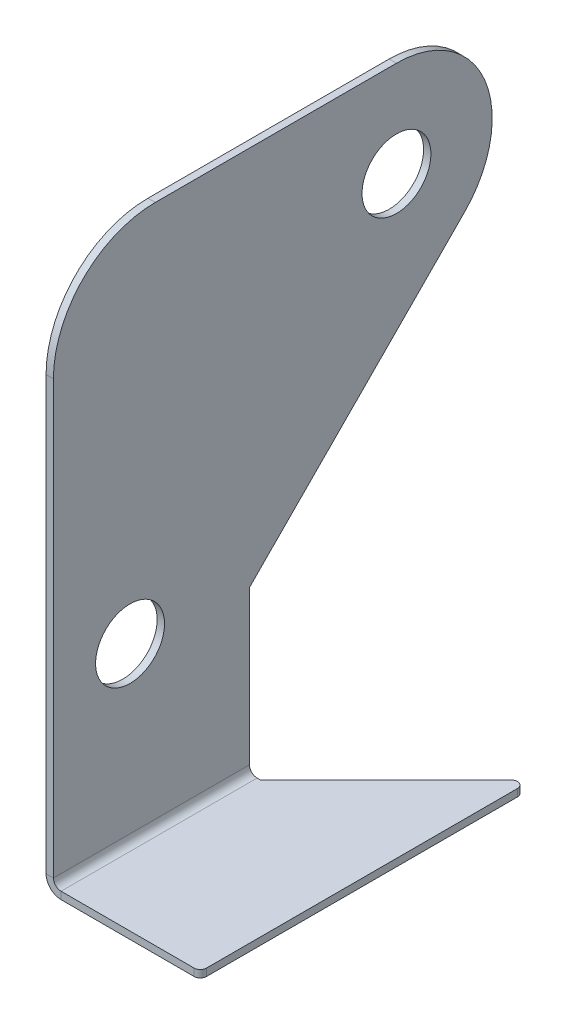
ISO-10303-21;
HEADER;
FILE_DESCRIPTION(('STEP AP214'),'2;1');
FILE_NAME('part.step','',(''),(''),'','','');
FILE_SCHEMA(('AUTOMOTIVE_DESIGN { 1 0 10303 214 1 1 1 1 }'));
ENDSEC;
DATA;
#1=APPLICATION_CONTEXT('core data for automotive mechanical design processes');
#2=APPLICATION_PROTOCOL_DEFINITION('international standard','automotive_design',2000,#1);
#3=PRODUCT_CONTEXT('',#1,'mechanical');
#4=PRODUCT('Part','Part','',(#3));
#5=PRODUCT_RELATED_PRODUCT_CATEGORY('part','',(#4));
#6=PRODUCT_DEFINITION_FORMATION('','',#4);
#7=PRODUCT_DEFINITION_CONTEXT('part definition',#1,'design');
#8=PRODUCT_DEFINITION('design','',#6,#7);
#9=PRODUCT_DEFINITION_SHAPE('','',#8);
#10=(LENGTH_UNIT() NAMED_UNIT(*) SI_UNIT(.MILLI.,.METRE.));
#11=(NAMED_UNIT(*) PLANE_ANGLE_UNIT() SI_UNIT($,.RADIAN.));
#12=(NAMED_UNIT(*) SI_UNIT($,.STERADIAN.) SOLID_ANGLE_UNIT());
#13=UNCERTAINTY_MEASURE_WITH_UNIT(LENGTH_MEASURE(1.E-05),#10,'distance_accuracy_value','');
#14=(GEOMETRIC_REPRESENTATION_CONTEXT(3) GLOBAL_UNCERTAINTY_ASSIGNED_CONTEXT((#13)) GLOBAL_UNIT_ASSIGNED_CONTEXT((#10,
#11,#12)) REPRESENTATION_CONTEXT('',''));
#15=CARTESIAN_POINT('',(0.,0.,0.));
#16=DIRECTION('',(0.,0.,1.));
#17=DIRECTION('',(1.,0.,0.));
#18=AXIS2_PLACEMENT_3D('',#15,#16,#17);
#19=CARTESIAN_POINT('',(0.,0.,81.28));
#20=DIRECTION('',(0.,0.,-1.));
#21=DIRECTION('',(0.,1.,0.));
#22=AXIS2_PLACEMENT_3D('',#19,#20,#21);
#23=PLANE('',#22);
#24=DIRECTION('',(-1.,0.,0.));
#25=VECTOR('',#24,1.);
#26=CARTESIAN_POINT('',(0.,6.21283999999999,81.28));
#27=LINE('',#26,#25);
#28=CARTESIAN_POINT('',(3.03784,6.21283999999999,81.28));
#29=VERTEX_POINT('',#28);
#30=CARTESIAN_POINT('',(0.,6.21283999999999,81.28));
#31=VERTEX_POINT('',#30);
#32=EDGE_CURVE('E11',#29,#31,#27,.T.);
#33=ORIENTED_EDGE('',*,*,#32,.F.);
#34=DIRECTION('',(0.,1.,0.));
#35=VECTOR('',#34,1.);
#36=CARTESIAN_POINT('',(3.03784,0.,81.28));
#37=LINE('',#36,#35);
#38=CARTESIAN_POINT('',(3.03784,185.42508,81.28));
#39=VERTEX_POINT('',#38);
#40=EDGE_CURVE('E113',#29,#39,#37,.T.);
#41=ORIENTED_EDGE('',*,*,#40,.T.);
#42=DIRECTION('',(-1.,0.,0.));
#43=VECTOR('',#42,1.);
#44=CARTESIAN_POINT('',(0.,185.42508,81.28));
#45=LINE('',#44,#43);
#46=CARTESIAN_POINT('',(0.,185.42508,81.28));
#47=VERTEX_POINT('',#46);
#48=EDGE_CURVE('E55',#39,#47,#45,.T.);
#49=ORIENTED_EDGE('',*,*,#48,.T.);
#50=DIRECTION('',(0.,1.,0.));
#51=VECTOR('',#50,1.);
#52=CARTESIAN_POINT('',(0.,0.,81.28));
#53=LINE('',#52,#51);
#54=EDGE_CURVE('E116',#31,#47,#53,.T.);
#55=ORIENTED_EDGE('',*,*,#54,.F.);
#56=EDGE_LOOP('',(#33,#41,#49,#55));
#57=FACE_BOUND('',#56,.T.);
#58=ADVANCED_FACE('F45',(#57),#23,.F.);
#59=CARTESIAN_POINT('',(0.,185.42508,39.0525));
#60=DIRECTION('',(1.,0.,0.));
#61=DIRECTION('',(0.,0.,-1.));
#62=AXIS2_PLACEMENT_3D('',#59,#60,#61);
#63=CYLINDRICAL_SURFACE('',#62,42.2275);
#64=ORIENTED_EDGE('',*,*,#48,.F.);
#65=CARTESIAN_POINT('',(3.03784,185.42508,39.0525));
#66=DIRECTION('',(1.,0.,0.));
#67=DIRECTION('',(0.,0.,-1.));
#68=AXIS2_PLACEMENT_3D('',#65,#66,#67);
#69=CIRCLE('',#68,42.2275);
#70=CARTESIAN_POINT('',(3.03784,227.65258,39.0525));
#71=VERTEX_POINT('',#70);
#72=EDGE_CURVE('E142',#39,#71,#69,.F.);
#73=ORIENTED_EDGE('',*,*,#72,.T.);
#74=DIRECTION('',(-1.,0.,0.));
#75=VECTOR('',#74,1.);
#76=CARTESIAN_POINT('',(0.,227.65258,39.0525));
#77=LINE('',#76,#75);
#78=CARTESIAN_POINT('',(0.,227.65258,39.0525));
#79=VERTEX_POINT('',#78);
#80=EDGE_CURVE('E185',#71,#79,#77,.T.);
#81=ORIENTED_EDGE('',*,*,#80,.T.);
#82=CARTESIAN_POINT('',(0.,185.42508,39.0525));
#83=DIRECTION('',(1.,0.,0.));
#84=DIRECTION('',(0.,0.,-1.));
#85=AXIS2_PLACEMENT_3D('',#82,#83,#84);
#86=CIRCLE('',#85,42.2275);
#87=EDGE_CURVE('E197',#47,#79,#86,.F.);
#88=ORIENTED_EDGE('',*,*,#87,.F.);
#89=EDGE_LOOP('',(#64,#73,#81,#88));
#90=FACE_BOUND('',#89,.T.);
#91=ADVANCED_FACE('F203',(#90),#63,.T.);
#92=CARTESIAN_POINT('',(0.,227.65258,0.));
#93=DIRECTION('',(0.,-1.,0.));
#94=DIRECTION('',(0.,0.,-1.));
#95=AXIS2_PLACEMENT_3D('',#92,#93,#94);
#96=PLANE('',#95);
#97=ORIENTED_EDGE('',*,*,#80,.F.);
#98=DIRECTION('',(0.,0.,-1.));
#99=VECTOR('',#98,1.);
#100=CARTESIAN_POINT('',(3.03784,227.65258,0.));
#101=LINE('',#100,#99);
#102=CARTESIAN_POINT('',(3.03784,227.65258,-60.96));
#103=VERTEX_POINT('',#102);
#104=EDGE_CURVE('E269',#71,#103,#101,.T.);
#105=ORIENTED_EDGE('',*,*,#104,.T.);
#106=DIRECTION('',(-1.,0.,0.));
#107=VECTOR('',#106,1.);
#108=CARTESIAN_POINT('',(0.,227.65258,-60.96));
#109=LINE('',#108,#107);
#110=CARTESIAN_POINT('',(0.,227.65258,-60.96));
#111=VERTEX_POINT('',#110);
#112=EDGE_CURVE('E182',#103,#111,#109,.T.);
#113=ORIENTED_EDGE('',*,*,#112,.T.);
#114=DIRECTION('',(0.,0.,-1.));
#115=VECTOR('',#114,1.);
#116=CARTESIAN_POINT('',(0.,227.65258,0.));
#117=LINE('',#116,#115);
#118=EDGE_CURVE('E204',#79,#111,#117,.T.);
#119=ORIENTED_EDGE('',*,*,#118,.F.);
#120=EDGE_LOOP('',(#97,#105,#113,#119));
#121=FACE_BOUND('',#120,.T.);
#122=ADVANCED_FACE('F272',(#121),#96,.F.);
#123=CARTESIAN_POINT('',(0.,187.96508,-60.96));
#124=DIRECTION('',(1.,0.,0.));
#125=DIRECTION('',(0.,0.,-1.));
#126=AXIS2_PLACEMENT_3D('',#123,#124,#125);
#127=CYLINDRICAL_SURFACE('',#126,39.6875);
#128=ORIENTED_EDGE('',*,*,#112,.F.);
#129=CARTESIAN_POINT('',(3.03784,187.96508,-60.96));
#130=DIRECTION('',(1.,0.,0.));
#131=DIRECTION('',(0.,0.,-1.));
#132=AXIS2_PLACEMENT_3D('',#129,#130,#131);
#133=CIRCLE('',#132,39.6875);
#134=CARTESIAN_POINT('',(3.03784,160.063269698735,-89.1838664637258));
#135=VERTEX_POINT('',#134);
#136=EDGE_CURVE('E266',#135,#103,#133,.T.);
#137=ORIENTED_EDGE('',*,*,#136,.F.);
#138=DIRECTION('',(-1.,0.,0.));
#139=VECTOR('',#138,1.);
#140=CARTESIAN_POINT('',(0.,160.063269698735,-89.1838664637258));
#141=LINE('',#140,#139);
#142=CARTESIAN_POINT('',(0.,160.063269698735,-89.1838664637258));
#143=VERTEX_POINT('',#142);
#144=EDGE_CURVE('E179',#135,#143,#141,.T.);
#145=ORIENTED_EDGE('',*,*,#144,.T.);
#146=CARTESIAN_POINT('',(0.,187.96508,-60.96));
#147=DIRECTION('',(1.,0.,0.));
#148=DIRECTION('',(0.,0.,-1.));
#149=AXIS2_PLACEMENT_3D('',#146,#147,#148);
#150=CIRCLE('',#149,39.6875);
#151=EDGE_CURVE('E206',#143,#111,#150,.T.);
#152=ORIENTED_EDGE('',*,*,#151,.T.);
#153=EDGE_LOOP('',(#128,#137,#145,#152));
#154=FACE_BOUND('',#153,.T.);
#155=ADVANCED_FACE('F277',(#154),#127,.T.);
#156=CARTESIAN_POINT('',(0.,34.5242051485853,34.922700188947));
#157=DIRECTION('',(0.,-0.703037739874391,-0.711152540818289));
#158=DIRECTION('',(0.,0.711152540818289,-0.703037739874391));
#159=AXIS2_PLACEMENT_3D('',#156,#157,#158);
#160=PLANE('',#159);
#161=ORIENTED_EDGE('',*,*,#144,.F.);
#162=DIRECTION('',(0.,0.711152540818289,-0.703037739874391));
#163=VECTOR('',#162,1.);
#164=CARTESIAN_POINT('',(3.03784,34.5242051485853,34.922700188947));
#165=LINE('',#164,#163);
#166=CARTESIAN_POINT('',(3.03784,69.85,0.));
#167=VERTEX_POINT('',#166);
#168=EDGE_CURVE('E263',#167,#135,#165,.T.);
#169=ORIENTED_EDGE('',*,*,#168,.F.);
#170=DIRECTION('',(-1.,0.,0.));
#171=VECTOR('',#170,1.);
#172=CARTESIAN_POINT('',(0.,69.85,0.));
#173=LINE('',#172,#171);
#174=CARTESIAN_POINT('',(0.,69.85,0.));
#175=VERTEX_POINT('',#174);
#176=EDGE_CURVE('E176',#167,#175,#173,.T.);
#177=ORIENTED_EDGE('',*,*,#176,.T.);
#178=DIRECTION('',(0.,0.711152540818289,-0.703037739874391));
#179=VECTOR('',#178,1.);
#180=CARTESIAN_POINT('',(0.,34.5242051485853,34.922700188947));
#181=LINE('',#180,#179);
#182=EDGE_CURVE('E212',#175,#143,#181,.T.);
#183=ORIENTED_EDGE('',*,*,#182,.T.);
#184=EDGE_LOOP('',(#161,#169,#177,#183));
#185=FACE_BOUND('',#184,.T.);
#186=ADVANCED_FACE('F286',(#185),#160,.T.);
#187=CARTESIAN_POINT('',(0.,0.,0.));
#188=DIRECTION('',(0.,0.,1.));
#189=DIRECTION('',(0.,-1.,0.));
#190=AXIS2_PLACEMENT_3D('',#187,#188,#189);
#191=PLANE('',#190);
#192=ORIENTED_EDGE('',*,*,#176,.F.);
#193=DIRECTION('',(0.,1.,0.));
#194=VECTOR('',#193,1.);
#195=CARTESIAN_POINT('',(3.03784,0.,0.));
#196=LINE('',#195,#194);
#197=CARTESIAN_POINT('',(3.03784,6.21284,0.));
#198=VERTEX_POINT('',#197);
#199=EDGE_CURVE('E254',#167,#198,#196,.F.);
#200=ORIENTED_EDGE('',*,*,#199,.T.);
#201=DIRECTION('',(-1.,0.,0.));
#202=VECTOR('',#201,1.);
#203=CARTESIAN_POINT('',(0.,6.21284,0.));
#204=LINE('',#203,#202);
#205=CARTESIAN_POINT('',(0.,6.21284,0.));
#206=VERTEX_POINT('',#205);
#207=EDGE_CURVE('E173',#198,#206,#204,.T.);
#208=ORIENTED_EDGE('',*,*,#207,.T.);
#209=DIRECTION('',(0.,-1.,0.));
#210=VECTOR('',#209,1.);
#211=CARTESIAN_POINT('',(0.,0.,0.));
#212=LINE('',#211,#210);
#213=EDGE_CURVE('E215',#175,#206,#212,.T.);
#214=ORIENTED_EDGE('',*,*,#213,.F.);
#215=EDGE_LOOP('',(#192,#200,#208,#214));
#216=FACE_BOUND('',#215,.T.);
#217=ADVANCED_FACE('F290',(#216),#191,.F.);
#218=CARTESIAN_POINT('',(6.21284,6.21284,0.));
#219=DIRECTION('',(0.,0.,-1.));
#220=DIRECTION('',(0.,1.,0.));
#221=AXIS2_PLACEMENT_3D('',#218,#219,#220);
#222=PLANE('',#221);
#223=ORIENTED_EDGE('',*,*,#207,.F.);
#224=CARTESIAN_POINT('',(6.21284,6.21284,0.));
#225=DIRECTION('',(0.,0.,-1.));
#226=DIRECTION('',(0.,1.,0.));
#227=AXIS2_PLACEMENT_3D('',#224,#225,#226);
#228=CIRCLE('',#227,3.175);
#229=CARTESIAN_POINT('',(6.21284,3.03784,0.));
#230=VERTEX_POINT('',#229);
#231=EDGE_CURVE('E131',#198,#230,#228,.F.);
#232=ORIENTED_EDGE('',*,*,#231,.T.);
#233=DIRECTION('',(0.,-1.,0.));
#234=VECTOR('',#233,1.);
#235=CARTESIAN_POINT('',(6.21284,0.,0.));
#236=LINE('',#235,#234);
#237=CARTESIAN_POINT('',(6.21284,0.,0.));
#238=VERTEX_POINT('',#237);
#239=EDGE_CURVE('E63',#230,#238,#236,.T.);
#240=ORIENTED_EDGE('',*,*,#239,.T.);
#241=CARTESIAN_POINT('',(6.21284,6.21284,0.));
#242=DIRECTION('',(0.,0.,1.));
#243=DIRECTION('',(0.,-1.,0.));
#244=AXIS2_PLACEMENT_3D('',#241,#242,#243);
#245=CIRCLE('',#244,6.21284);
#246=EDGE_CURVE('E241',#206,#238,#245,.T.);
#247=ORIENTED_EDGE('',*,*,#246,.F.);
#248=EDGE_LOOP('',(#223,#232,#240,#247));
#249=FACE_BOUND('',#248,.T.);
#250=ADVANCED_FACE('F291',(#249),#222,.T.);
#251=CARTESIAN_POINT('',(3.175,0.,0.));
#252=DIRECTION('',(0.,0.,1.));
#253=DIRECTION('',(-1.,0.,0.));
#254=AXIS2_PLACEMENT_3D('',#251,#252,#253);
#255=PLANE('',#254);
#256=ORIENTED_EDGE('',*,*,#239,.F.);
#257=DIRECTION('',(1.,0.,0.));
#258=VECTOR('',#257,1.);
#259=CARTESIAN_POINT('',(3.175,3.03784,0.));
#260=LINE('',#259,#258);
#261=CARTESIAN_POINT('',(7.62,3.03784,0.));
#262=VERTEX_POINT('',#261);
#263=EDGE_CURVE('E247',#262,#230,#260,.F.);
#264=ORIENTED_EDGE('',*,*,#263,.F.);
#265=DIRECTION('',(0.,-1.,0.));
#266=VECTOR('',#265,1.);
#267=CARTESIAN_POINT('',(7.62,0.,0.));
#268=LINE('',#267,#266);
#269=CARTESIAN_POINT('',(7.62,0.,0.));
#270=VERTEX_POINT('',#269);
#271=EDGE_CURVE('E169',#262,#270,#268,.T.);
#272=ORIENTED_EDGE('',*,*,#271,.T.);
#273=DIRECTION('',(-1.,0.,0.));
#274=VECTOR('',#273,1.);
#275=CARTESIAN_POINT('',(3.175,0.,0.));
#276=LINE('',#275,#274);
#277=EDGE_CURVE('E226',#270,#238,#276,.T.);
#278=ORIENTED_EDGE('',*,*,#277,.T.);
#279=EDGE_LOOP('',(#256,#264,#272,#278));
#280=FACE_BOUND('',#279,.T.);
#281=ADVANCED_FACE('F328',(#280),#255,.F.);
#282=CARTESIAN_POINT('',(63.9445,0.,-56.3245000000002));
#283=DIRECTION('',(0.707106781186549,0.,0.707106781186546));
#284=DIRECTION('',(-0.707106781186546,0.,0.707106781186549));
#285=AXIS2_PLACEMENT_3D('',#282,#283,#284);
#286=PLANE('',#285);
#287=ORIENTED_EDGE('',*,*,#271,.F.);
#288=DIRECTION('',(-0.707106781186546,0.,0.707106781186549));
#289=VECTOR('',#288,1.);
#290=CARTESIAN_POINT('',(63.9445,3.03784,-56.3245000000002));
#291=LINE('',#290,#289);
#292=CARTESIAN_POINT('',(59.6084487757862,3.03784000000001,-51.9884487757864));
#293=VERTEX_POINT('',#292);
#294=EDGE_CURVE('E257',#293,#262,#291,.T.);
#295=ORIENTED_EDGE('',*,*,#294,.F.);
#296=DIRECTION('',(0.,-1.,0.));
#297=VECTOR('',#296,1.);
#298=CARTESIAN_POINT('',(59.6084487757862,0.,-51.9884487757864));
#299=LINE('',#298,#297);
#300=CARTESIAN_POINT('',(59.6084487757862,0.,-51.9884487757864));
#301=VERTEX_POINT('',#300);
#302=EDGE_CURVE('E166',#293,#301,#299,.T.);
#303=ORIENTED_EDGE('',*,*,#302,.T.);
#304=DIRECTION('',(-0.707106781186546,0.,0.707106781186549));
#305=VECTOR('',#304,1.);
#306=CARTESIAN_POINT('',(63.9445,0.,-56.3245000000002));
#307=LINE('',#306,#305);
#308=EDGE_CURVE('E229',#301,#270,#307,.T.);
#309=ORIENTED_EDGE('',*,*,#308,.T.);
#310=EDGE_LOOP('',(#287,#295,#303,#309));
#311=FACE_BOUND('',#310,.T.);
#312=ADVANCED_FACE('F331',(#311),#286,.F.);
#313=CARTESIAN_POINT('',(61.4045,0.,-50.1923975515726));
#314=DIRECTION('',(0.,-1.,0.));
#315=DIRECTION('',(0.,0.,-1.));
#316=AXIS2_PLACEMENT_3D('',#313,#314,#315);
#317=CYLINDRICAL_SURFACE('',#316,2.54);
#318=ORIENTED_EDGE('',*,*,#302,.F.);
#319=CARTESIAN_POINT('',(61.4045,3.03784000000001,-50.1923975515726));
#320=DIRECTION('',(0.,-1.,0.));
#321=DIRECTION('',(0.,0.,-1.));
#322=AXIS2_PLACEMENT_3D('',#319,#320,#321);
#323=CIRCLE('',#322,2.54);
#324=CARTESIAN_POINT('',(63.9445,3.03784000000001,-50.1923975515726));
#325=VERTEX_POINT('',#324);
#326=EDGE_CURVE('E136',#293,#325,#323,.T.);
#327=ORIENTED_EDGE('',*,*,#326,.T.);
#328=DIRECTION('',(0.,-1.,0.));
#329=VECTOR('',#328,1.);
#330=CARTESIAN_POINT('',(63.9445,0.,-50.1923975515726));
#331=LINE('',#330,#329);
#332=CARTESIAN_POINT('',(63.9445,0.,-50.1923975515726));
#333=VERTEX_POINT('',#332);
#334=EDGE_CURVE('E163',#325,#333,#331,.T.);
#335=ORIENTED_EDGE('',*,*,#334,.T.);
#336=CARTESIAN_POINT('',(61.4045,0.,-50.1923975515726));
#337=DIRECTION('',(0.,-1.,0.));
#338=DIRECTION('',(0.,0.,-1.));
#339=AXIS2_PLACEMENT_3D('',#336,#337,#338);
#340=CIRCLE('',#339,2.54);
#341=EDGE_CURVE('E232',#301,#333,#340,.T.);
#342=ORIENTED_EDGE('',*,*,#341,.F.);
#343=EDGE_LOOP('',(#318,#327,#335,#342));
#344=FACE_BOUND('',#343,.T.);
#345=ADVANCED_FACE('F333',(#344),#317,.T.);
#346=CARTESIAN_POINT('',(63.9445,0.,0.));
#347=DIRECTION('',(-1.,0.,0.));
#348=DIRECTION('',(0.,0.,-1.));
#349=AXIS2_PLACEMENT_3D('',#346,#347,#348);
#350=PLANE('',#349);
#351=ORIENTED_EDGE('',*,*,#334,.F.);
#352=DIRECTION('',(0.,0.,-1.));
#353=VECTOR('',#352,1.);
#354=CARTESIAN_POINT('',(63.9445,3.03784,0.));
#355=LINE('',#354,#353);
#356=CARTESIAN_POINT('',(63.9445,3.03783999999999,78.74));
#357=VERTEX_POINT('',#356);
#358=EDGE_CURVE('E251',#357,#325,#355,.T.);
#359=ORIENTED_EDGE('',*,*,#358,.F.);
#360=DIRECTION('',(0.,-1.,0.));
#361=VECTOR('',#360,1.);
#362=CARTESIAN_POINT('',(63.9445,0.,78.74));
#363=LINE('',#362,#361);
#364=CARTESIAN_POINT('',(63.9445,0.,78.74));
#365=VERTEX_POINT('',#364);
#366=EDGE_CURVE('E160',#357,#365,#363,.T.);
#367=ORIENTED_EDGE('',*,*,#366,.T.);
#368=DIRECTION('',(0.,0.,-1.));
#369=VECTOR('',#368,1.);
#370=CARTESIAN_POINT('',(63.9445,0.,0.));
#371=LINE('',#370,#369);
#372=EDGE_CURVE('E217',#365,#333,#371,.T.);
#373=ORIENTED_EDGE('',*,*,#372,.T.);
#374=EDGE_LOOP('',(#351,#359,#367,#373));
#375=FACE_BOUND('',#374,.T.);
#376=ADVANCED_FACE('F309',(#375),#350,.F.);
#377=CARTESIAN_POINT('',(61.4045,0.,78.74));
#378=DIRECTION('',(0.,-1.,0.));
#379=DIRECTION('',(0.,0.,-1.));
#380=AXIS2_PLACEMENT_3D('',#377,#378,#379);
#381=CYLINDRICAL_SURFACE('',#380,2.54);
#382=ORIENTED_EDGE('',*,*,#366,.F.);
#383=CARTESIAN_POINT('',(61.4045,3.03783999999999,78.74));
#384=DIRECTION('',(0.,-1.,0.));
#385=DIRECTION('',(0.,0.,-1.));
#386=AXIS2_PLACEMENT_3D('',#383,#384,#385);
#387=CIRCLE('',#386,2.54);
#388=CARTESIAN_POINT('',(61.4045,3.03783999999999,81.28));
#389=VERTEX_POINT('',#388);
#390=EDGE_CURVE('E248',#357,#389,#387,.T.);
#391=ORIENTED_EDGE('',*,*,#390,.T.);
#392=DIRECTION('',(0.,-1.,0.));
#393=VECTOR('',#392,1.);
#394=CARTESIAN_POINT('',(61.4045,0.,81.28));
#395=LINE('',#394,#393);
#396=CARTESIAN_POINT('',(61.4045,0.,81.28));
#397=VERTEX_POINT('',#396);
#398=EDGE_CURVE('E157',#389,#397,#395,.T.);
#399=ORIENTED_EDGE('',*,*,#398,.T.);
#400=CARTESIAN_POINT('',(61.4045,0.,78.74));
#401=DIRECTION('',(0.,-1.,0.));
#402=DIRECTION('',(0.,0.,-1.));
#403=AXIS2_PLACEMENT_3D('',#400,#401,#402);
#404=CIRCLE('',#403,2.54);
#405=EDGE_CURVE('E220',#365,#397,#404,.T.);
#406=ORIENTED_EDGE('',*,*,#405,.F.);
#407=EDGE_LOOP('',(#382,#391,#399,#406));
#408=FACE_BOUND('',#407,.T.);
#409=ADVANCED_FACE('F318',(#408),#381,.T.);
#410=CARTESIAN_POINT('',(3.175,0.,81.28));
#411=DIRECTION('',(0.,0.,1.));
#412=DIRECTION('',(-1.,0.,0.));
#413=AXIS2_PLACEMENT_3D('',#410,#411,#412);
#414=PLANE('',#413);
#415=ORIENTED_EDGE('',*,*,#398,.F.);
#416=DIRECTION('',(1.,0.,0.));
#417=VECTOR('',#416,1.);
#418=CARTESIAN_POINT('',(3.175,3.03783999999999,81.28));
#419=LINE('',#418,#417);
#420=CARTESIAN_POINT('',(6.21284,3.03783999999999,81.28));
#421=VERTEX_POINT('',#420);
#422=EDGE_CURVE('E245',#389,#421,#419,.F.);
#423=ORIENTED_EDGE('',*,*,#422,.T.);
#424=DIRECTION('',(0.,-1.,0.));
#425=VECTOR('',#424,1.);
#426=CARTESIAN_POINT('',(6.21284,0.,81.28));
#427=LINE('',#426,#425);
#428=CARTESIAN_POINT('',(6.21284,0.,81.28));
#429=VERTEX_POINT('',#428);
#430=EDGE_CURVE('E49',#421,#429,#427,.T.);
#431=ORIENTED_EDGE('',*,*,#430,.T.);
#432=DIRECTION('',(-1.,0.,0.));
#433=VECTOR('',#432,1.);
#434=CARTESIAN_POINT('',(3.175,0.,81.28));
#435=LINE('',#434,#433);
#436=EDGE_CURVE('E223',#397,#429,#435,.T.);
#437=ORIENTED_EDGE('',*,*,#436,.F.);
#438=EDGE_LOOP('',(#415,#423,#431,#437));
#439=FACE_BOUND('',#438,.T.);
#440=ADVANCED_FACE('F321',(#439),#414,.T.);
#441=CARTESIAN_POINT('',(0.,74.4622886801529,49.5046));
#442=DIRECTION('',(1.,0.,0.));
#443=DIRECTION('',(0.,0.,-1.));
#444=AXIS2_PLACEMENT_3D('',#441,#442,#443);
#445=CYLINDRICAL_SURFACE('',#444,14.2875);
#446=CARTESIAN_POINT('',(0.,74.4622886801529,49.5046));
#447=DIRECTION('',(1.,0.,0.));
#448=DIRECTION('',(0.,0.,-1.));
#449=AXIS2_PLACEMENT_3D('',#446,#447,#448);
#450=CIRCLE('',#449,14.2875);
#451=CARTESIAN_POINT('',(0.,74.4622886801529,35.2171));
#452=VERTEX_POINT('',#451);
#453=EDGE_CURVE('E243',#452,#452,#450,.T.);
#454=ORIENTED_EDGE('',*,*,#453,.F.);
#455=EDGE_LOOP('',(#454));
#456=FACE_BOUND('',#455,.T.);
#457=CARTESIAN_POINT('',(3.03784,74.4622886801529,49.5046));
#458=DIRECTION('',(1.,0.,0.));
#459=DIRECTION('',(0.,0.,-1.));
#460=AXIS2_PLACEMENT_3D('',#457,#458,#459);
#461=CIRCLE('',#460,14.2875);
#462=CARTESIAN_POINT('',(3.03784,74.4622886801529,35.2171));
#463=VERTEX_POINT('',#462);
#464=EDGE_CURVE('E149',#463,#463,#461,.T.);
#465=ORIENTED_EDGE('',*,*,#464,.T.);
#466=EDGE_LOOP('',(#465));
#467=FACE_BOUND('',#466,.T.);
#468=ADVANCED_FACE('F351',(#456,#467),#445,.F.);
#469=CARTESIAN_POINT('',(0.,187.96508,-60.96));
#470=DIRECTION('',(1.,0.,0.));
#471=DIRECTION('',(0.,0.,-1.));
#472=AXIS2_PLACEMENT_3D('',#469,#470,#471);
#473=CYLINDRICAL_SURFACE('',#472,14.2875);
#474=CARTESIAN_POINT('',(0.,187.96508,-60.96));
#475=DIRECTION('',(1.,0.,0.));
#476=DIRECTION('',(0.,0.,-1.));
#477=AXIS2_PLACEMENT_3D('',#474,#475,#476);
#478=CIRCLE('',#477,14.2875);
#479=CARTESIAN_POINT('',(0.,187.96508,-75.2475));
#480=VERTEX_POINT('',#479);
#481=EDGE_CURVE('E201',#480,#480,#478,.T.);
#482=ORIENTED_EDGE('',*,*,#481,.F.);
#483=EDGE_LOOP('',(#482));
#484=FACE_BOUND('',#483,.T.);
#485=CARTESIAN_POINT('',(3.03784,187.96508,-60.96));
#486=DIRECTION('',(1.,0.,0.));
#487=DIRECTION('',(0.,0.,-1.));
#488=AXIS2_PLACEMENT_3D('',#485,#486,#487);
#489=CIRCLE('',#488,14.2875);
#490=CARTESIAN_POINT('',(3.03784,187.96508,-75.2475));
#491=VERTEX_POINT('',#490);
#492=EDGE_CURVE('E143',#491,#491,#489,.T.);
#493=ORIENTED_EDGE('',*,*,#492,.T.);
#494=EDGE_LOOP('',(#493));
#495=FACE_BOUND('',#494,.T.);
#496=ADVANCED_FACE('F47',(#484,#495),#473,.F.);
#497=CARTESIAN_POINT('',(6.21284,6.21283999999999,81.28));
#498=DIRECTION('',(0.,0.,-1.));
#499=DIRECTION('',(-1.,0.,0.));
#500=AXIS2_PLACEMENT_3D('',#497,#498,#499);
#501=PLANE('',#500);
#502=CARTESIAN_POINT('',(6.21284,6.21283999999999,81.28));
#503=DIRECTION('',(0.,0.,-1.));
#504=DIRECTION('',(0.,1.,0.));
#505=AXIS2_PLACEMENT_3D('',#502,#503,#504);
#506=CIRCLE('',#505,3.175);
#507=EDGE_CURVE('E129',#421,#29,#506,.T.);
#508=ORIENTED_EDGE('',*,*,#507,.T.);
#509=ORIENTED_EDGE('',*,*,#32,.T.);
#510=CARTESIAN_POINT('',(6.21284,6.21283999999999,81.28));
#511=DIRECTION('',(0.,0.,1.));
#512=DIRECTION('',(1.,0.,0.));
#513=AXIS2_PLACEMENT_3D('',#510,#511,#512);
#514=CIRCLE('',#513,6.21284);
#515=EDGE_CURVE('E239',#429,#31,#514,.F.);
#516=ORIENTED_EDGE('',*,*,#515,.F.);
#517=ORIENTED_EDGE('',*,*,#430,.F.);
#518=EDGE_LOOP('',(#508,#509,#516,#517));
#519=FACE_BOUND('',#518,.T.);
#520=ADVANCED_FACE('F146',(#519),#501,.F.);
#521=CARTESIAN_POINT('',(3.175,0.,0.));
#522=DIRECTION('',(0.,-1.,0.));
#523=DIRECTION('',(0.,0.,-1.));
#524=AXIS2_PLACEMENT_3D('',#521,#522,#523);
#525=PLANE('',#524);
#526=ORIENTED_EDGE('',*,*,#436,.T.);
#527=DIRECTION('',(0.,0.,1.));
#528=VECTOR('',#527,1.);
#529=CARTESIAN_POINT('',(6.21284,0.,0.));
#530=LINE('',#529,#528);
#531=EDGE_CURVE('E236',#429,#238,#530,.F.);
#532=ORIENTED_EDGE('',*,*,#531,.T.);
#533=ORIENTED_EDGE('',*,*,#277,.F.);
#534=ORIENTED_EDGE('',*,*,#308,.F.);
#535=ORIENTED_EDGE('',*,*,#341,.T.);
#536=ORIENTED_EDGE('',*,*,#372,.F.);
#537=ORIENTED_EDGE('',*,*,#405,.T.);
#538=EDGE_LOOP('',(#526,#532,#533,#534,#535,#536,#537));
#539=FACE_BOUND('',#538,.T.);
#540=ADVANCED_FACE('F314',(#539),#525,.T.);
#541=CARTESIAN_POINT('',(0.,0.,0.));
#542=DIRECTION('',(1.,0.,0.));
#543=DIRECTION('',(0.,0.,-1.));
#544=AXIS2_PLACEMENT_3D('',#541,#542,#543);
#545=PLANE('',#544);
#546=ORIENTED_EDGE('',*,*,#453,.T.);
#547=EDGE_LOOP('',(#546));
#548=FACE_BOUND('',#547,.T.);
#549=ORIENTED_EDGE('',*,*,#481,.T.);
#550=EDGE_LOOP('',(#549));
#551=FACE_BOUND('',#550,.T.);
#552=ORIENTED_EDGE('',*,*,#213,.T.);
#553=DIRECTION('',(0.,0.,1.));
#554=VECTOR('',#553,1.);
#555=CARTESIAN_POINT('',(0.,6.21283999999999,81.28));
#556=LINE('',#555,#554);
#557=EDGE_CURVE('E200',#206,#31,#556,.T.);
#558=ORIENTED_EDGE('',*,*,#557,.T.);
#559=ORIENTED_EDGE('',*,*,#54,.T.);
#560=ORIENTED_EDGE('',*,*,#87,.T.);
#561=ORIENTED_EDGE('',*,*,#118,.T.);
#562=ORIENTED_EDGE('',*,*,#151,.F.);
#563=ORIENTED_EDGE('',*,*,#182,.F.);
#564=EDGE_LOOP('',(#552,#558,#559,#560,#561,#562,#563));
#565=FACE_BOUND('',#564,.T.);
#566=ADVANCED_FACE('F195',(#548,#551,#565),#545,.F.);
#567=CARTESIAN_POINT('',(6.21284,6.21284,0.));
#568=DIRECTION('',(0.,0.,-1.));
#569=DIRECTION('',(0.,1.,0.));
#570=AXIS2_PLACEMENT_3D('',#567,#568,#569);
#571=CYLINDRICAL_SURFACE('',#570,6.21284);
#572=ORIENTED_EDGE('',*,*,#246,.T.);
#573=ORIENTED_EDGE('',*,*,#531,.F.);
#574=ORIENTED_EDGE('',*,*,#515,.T.);
#575=ORIENTED_EDGE('',*,*,#557,.F.);
#576=EDGE_LOOP('',(#572,#573,#574,#575));
#577=FACE_BOUND('',#576,.T.);
#578=ADVANCED_FACE('F294',(#577),#571,.T.);
#579=CARTESIAN_POINT('',(3.175,3.03784,0.));
#580=DIRECTION('',(0.,-1.,0.));
#581=DIRECTION('',(0.,0.,-1.));
#582=AXIS2_PLACEMENT_3D('',#579,#580,#581);
#583=PLANE('',#582);
#584=ORIENTED_EDGE('',*,*,#422,.F.);
#585=ORIENTED_EDGE('',*,*,#390,.F.);
#586=ORIENTED_EDGE('',*,*,#358,.T.);
#587=ORIENTED_EDGE('',*,*,#326,.F.);
#588=ORIENTED_EDGE('',*,*,#294,.T.);
#589=ORIENTED_EDGE('',*,*,#263,.T.);
#590=DIRECTION('',(0.,0.,-1.));
#591=VECTOR('',#590,1.);
#592=CARTESIAN_POINT('',(6.21284,3.03784,0.));
#593=LINE('',#592,#591);
#594=EDGE_CURVE('E135',#421,#230,#593,.T.);
#595=ORIENTED_EDGE('',*,*,#594,.F.);
#596=EDGE_LOOP('',(#584,#585,#586,#587,#588,#589,#595));
#597=FACE_BOUND('',#596,.T.);
#598=ADVANCED_FACE('F323',(#597),#583,.F.);
#599=CARTESIAN_POINT('',(3.03784,0.,0.));
#600=DIRECTION('',(1.,0.,0.));
#601=DIRECTION('',(0.,0.,-1.));
#602=AXIS2_PLACEMENT_3D('',#599,#600,#601);
#603=PLANE('',#602);
#604=ORIENTED_EDGE('',*,*,#464,.F.);
#605=EDGE_LOOP('',(#604));
#606=FACE_BOUND('',#605,.T.);
#607=ORIENTED_EDGE('',*,*,#492,.F.);
#608=EDGE_LOOP('',(#607));
#609=FACE_BOUND('',#608,.T.);
#610=ORIENTED_EDGE('',*,*,#199,.F.);
#611=ORIENTED_EDGE('',*,*,#168,.T.);
#612=ORIENTED_EDGE('',*,*,#136,.T.);
#613=ORIENTED_EDGE('',*,*,#104,.F.);
#614=ORIENTED_EDGE('',*,*,#72,.F.);
#615=ORIENTED_EDGE('',*,*,#40,.F.);
#616=DIRECTION('',(0.,0.,-1.));
#617=VECTOR('',#616,1.);
#618=CARTESIAN_POINT('',(3.03784,6.21284,0.));
#619=LINE('',#618,#617);
#620=EDGE_CURVE('E126',#198,#29,#619,.F.);
#621=ORIENTED_EDGE('',*,*,#620,.F.);
#622=EDGE_LOOP('',(#610,#611,#612,#613,#614,#615,#621));
#623=FACE_BOUND('',#622,.T.);
#624=ADVANCED_FACE('F139',(#606,#609,#623),#603,.T.);
#625=CARTESIAN_POINT('',(6.21284,6.21284,0.));
#626=DIRECTION('',(0.,0.,-1.));
#627=DIRECTION('',(0.,1.,0.));
#628=AXIS2_PLACEMENT_3D('',#625,#626,#627);
#629=CYLINDRICAL_SURFACE('',#628,3.175);
#630=ORIENTED_EDGE('',*,*,#231,.F.);
#631=ORIENTED_EDGE('',*,*,#620,.T.);
#632=ORIENTED_EDGE('',*,*,#507,.F.);
#633=ORIENTED_EDGE('',*,*,#594,.T.);
#634=EDGE_LOOP('',(#630,#631,#632,#633));
#635=FACE_BOUND('',#634,.T.);
#636=ADVANCED_FACE('F127',(#635),#629,.F.);
#637=CLOSED_SHELL('',(#58,#91,#122,#155,#186,#217,#250,#281,#312,#345,#376,#409,#440,#468,#496,
#520,#540,#566,#578,#598,#624,#636));
#638=MANIFOLD_SOLID_BREP('B2',#637);
#639=ADVANCED_BREP_SHAPE_REPRESENTATION('',(#18,#638),#14);
#640=SHAPE_DEFINITION_REPRESENTATION(#9,#639);
ENDSEC;
END-ISO-10303-21;
